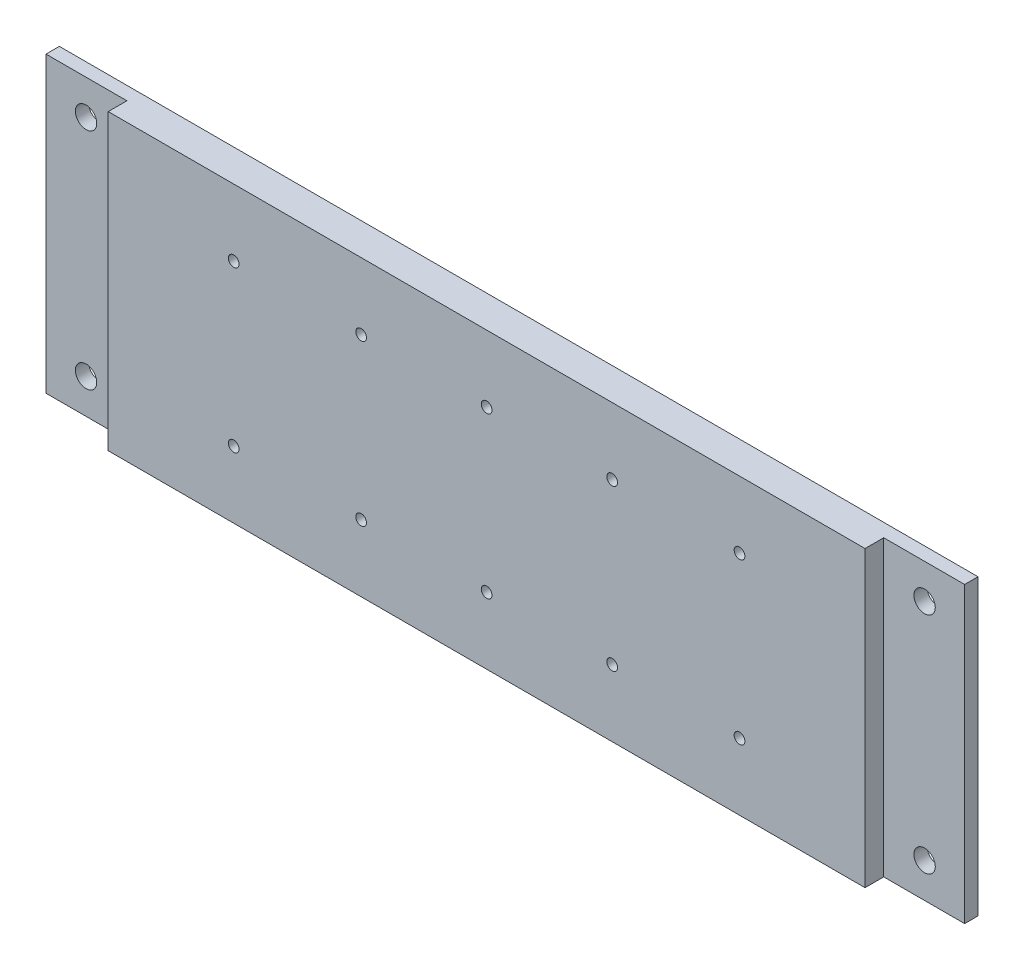
ISO-10303-21;
HEADER;
FILE_DESCRIPTION(('STEP AP214'),'2;1');
FILE_NAME('part.step','',(''),(''),'','','');
FILE_SCHEMA(('AUTOMOTIVE_DESIGN { 1 0 10303 214 1 1 1 1 }'));
ENDSEC;
DATA;
#1=APPLICATION_CONTEXT('core data for automotive mechanical design processes');
#2=APPLICATION_PROTOCOL_DEFINITION('international standard','automotive_design',2000,#1);
#3=PRODUCT_CONTEXT('',#1,'mechanical');
#4=PRODUCT('Part','Part','',(#3));
#5=PRODUCT_RELATED_PRODUCT_CATEGORY('part','',(#4));
#6=PRODUCT_DEFINITION_FORMATION('','',#4);
#7=PRODUCT_DEFINITION_CONTEXT('part definition',#1,'design');
#8=PRODUCT_DEFINITION('design','',#6,#7);
#9=PRODUCT_DEFINITION_SHAPE('','',#8);
#10=(LENGTH_UNIT() NAMED_UNIT(*) SI_UNIT(.MILLI.,.METRE.));
#11=(NAMED_UNIT(*) PLANE_ANGLE_UNIT() SI_UNIT($,.RADIAN.));
#12=(NAMED_UNIT(*) SI_UNIT($,.STERADIAN.) SOLID_ANGLE_UNIT());
#13=UNCERTAINTY_MEASURE_WITH_UNIT(LENGTH_MEASURE(1.E-05),#10,'distance_accuracy_value','');
#14=(GEOMETRIC_REPRESENTATION_CONTEXT(3) GLOBAL_UNCERTAINTY_ASSIGNED_CONTEXT((#13)) GLOBAL_UNIT_ASSIGNED_CONTEXT((#10,
#11,#12)) REPRESENTATION_CONTEXT('',''));
#15=CARTESIAN_POINT('',(0.,0.,0.));
#16=DIRECTION('',(0.,0.,1.));
#17=DIRECTION('',(1.,0.,0.));
#18=AXIS2_PLACEMENT_3D('',#15,#16,#17);
#19=CARTESIAN_POINT('',(-86.,27.5,6.));
#20=DIRECTION('',(1.,0.,0.));
#21=DIRECTION('',(0.,0.,-1.));
#22=AXIS2_PLACEMENT_3D('',#19,#20,#21);
#23=PLANE('',#22);
#24=DIRECTION('',(0.,-1.,0.));
#25=VECTOR('',#24,1.);
#26=CARTESIAN_POINT('',(-86.,27.5,2.5));
#27=LINE('',#26,#25);
#28=CARTESIAN_POINT('',(-86.,27.5,2.5));
#29=VERTEX_POINT('',#28);
#30=CARTESIAN_POINT('',(-86.,-27.5,2.5));
#31=VERTEX_POINT('',#30);
#32=EDGE_CURVE('E148',#29,#31,#27,.T.);
#33=ORIENTED_EDGE('',*,*,#32,.F.);
#34=DIRECTION('',(0.,0.,-1.));
#35=VECTOR('',#34,1.);
#36=CARTESIAN_POINT('',(-86.,27.5,6.));
#37=LINE('',#36,#35);
#38=CARTESIAN_POINT('',(-86.,27.5,0.));
#39=VERTEX_POINT('',#38);
#40=EDGE_CURVE('E42',#29,#39,#37,.T.);
#41=ORIENTED_EDGE('',*,*,#40,.T.);
#42=DIRECTION('',(0.,-1.,0.));
#43=VECTOR('',#42,1.);
#44=CARTESIAN_POINT('',(-86.,27.5,0.));
#45=LINE('',#44,#43);
#46=CARTESIAN_POINT('',(-86.,-27.5,0.));
#47=VERTEX_POINT('',#46);
#48=EDGE_CURVE('E128',#39,#47,#45,.T.);
#49=ORIENTED_EDGE('',*,*,#48,.T.);
#50=DIRECTION('',(0.,0.,-1.));
#51=VECTOR('',#50,1.);
#52=CARTESIAN_POINT('',(-86.,-27.5,6.));
#53=LINE('',#52,#51);
#54=EDGE_CURVE('E142',#31,#47,#53,.T.);
#55=ORIENTED_EDGE('',*,*,#54,.F.);
#56=EDGE_LOOP('',(#33,#41,#49,#55));
#57=FACE_BOUND('',#56,.T.);
#58=ADVANCED_FACE('F34',(#57),#23,.F.);
#59=CARTESIAN_POINT('',(86.,27.5,6.));
#60=DIRECTION('',(-1.,0.,0.));
#61=DIRECTION('',(0.,0.,1.));
#62=AXIS2_PLACEMENT_3D('',#59,#60,#61);
#63=PLANE('',#62);
#64=DIRECTION('',(0.,0.,-1.));
#65=VECTOR('',#64,1.);
#66=CARTESIAN_POINT('',(86.,27.5,6.));
#67=LINE('',#66,#65);
#68=CARTESIAN_POINT('',(86.,27.5,2.5));
#69=VERTEX_POINT('',#68);
#70=CARTESIAN_POINT('',(86.,27.5,0.));
#71=VERTEX_POINT('',#70);
#72=EDGE_CURVE('E11',#69,#71,#67,.T.);
#73=ORIENTED_EDGE('',*,*,#72,.F.);
#74=DIRECTION('',(0.,1.,0.));
#75=VECTOR('',#74,1.);
#76=CARTESIAN_POINT('',(86.,27.5,2.5));
#77=LINE('',#76,#75);
#78=CARTESIAN_POINT('',(86.,-27.5,2.5));
#79=VERTEX_POINT('',#78);
#80=EDGE_CURVE('E99',#79,#69,#77,.T.);
#81=ORIENTED_EDGE('',*,*,#80,.F.);
#82=DIRECTION('',(0.,0.,-1.));
#83=VECTOR('',#82,1.);
#84=CARTESIAN_POINT('',(86.,-27.5,6.));
#85=LINE('',#84,#83);
#86=CARTESIAN_POINT('',(86.,-27.5,0.));
#87=VERTEX_POINT('',#86);
#88=EDGE_CURVE('E121',#79,#87,#85,.T.);
#89=ORIENTED_EDGE('',*,*,#88,.T.);
#90=DIRECTION('',(0.,1.,0.));
#91=VECTOR('',#90,1.);
#92=CARTESIAN_POINT('',(86.,27.5,0.));
#93=LINE('',#92,#91);
#94=EDGE_CURVE('E120',#87,#71,#93,.T.);
#95=ORIENTED_EDGE('',*,*,#94,.T.);
#96=EDGE_LOOP('',(#73,#81,#89,#95));
#97=FACE_BOUND('',#96,.T.);
#98=ADVANCED_FACE('F36',(#97),#63,.F.);
#99=CARTESIAN_POINT('',(-86.,27.5,6.));
#100=DIRECTION('',(0.,-1.,0.));
#101=DIRECTION('',(0.,0.,-1.));
#102=AXIS2_PLACEMENT_3D('',#99,#100,#101);
#103=PLANE('',#102);
#104=DIRECTION('',(-1.,0.,0.));
#105=VECTOR('',#104,1.);
#106=CARTESIAN_POINT('',(-86.,27.5,6.));
#107=LINE('',#106,#105);
#108=CARTESIAN_POINT('',(70.85,27.5,6.));
#109=VERTEX_POINT('',#108);
#110=CARTESIAN_POINT('',(-70.85,27.5,6.));
#111=VERTEX_POINT('',#110);
#112=EDGE_CURVE('E140',#109,#111,#107,.T.);
#113=ORIENTED_EDGE('',*,*,#112,.F.);
#114=DIRECTION('',(0.,0.,1.));
#115=VECTOR('',#114,1.);
#116=CARTESIAN_POINT('',(70.85,27.5,2.5));
#117=LINE('',#116,#115);
#118=CARTESIAN_POINT('',(70.85,27.5,2.5));
#119=VERTEX_POINT('',#118);
#120=EDGE_CURVE('E49',#119,#109,#117,.T.);
#121=ORIENTED_EDGE('',*,*,#120,.F.);
#122=DIRECTION('',(-1.,0.,0.));
#123=VECTOR('',#122,1.);
#124=CARTESIAN_POINT('',(86.,27.5,2.5));
#125=LINE('',#124,#123);
#126=EDGE_CURVE('E103',#69,#119,#125,.T.);
#127=ORIENTED_EDGE('',*,*,#126,.F.);
#128=ORIENTED_EDGE('',*,*,#72,.T.);
#129=DIRECTION('',(-1.,0.,0.));
#130=VECTOR('',#129,1.);
#131=CARTESIAN_POINT('',(-86.,27.5,0.));
#132=LINE('',#131,#130);
#133=EDGE_CURVE('E125',#71,#39,#132,.T.);
#134=ORIENTED_EDGE('',*,*,#133,.T.);
#135=ORIENTED_EDGE('',*,*,#40,.F.);
#136=DIRECTION('',(-1.,0.,0.));
#137=VECTOR('',#136,1.);
#138=CARTESIAN_POINT('',(-86.,27.5,2.5));
#139=LINE('',#138,#137);
#140=CARTESIAN_POINT('',(-70.85,27.5,2.5));
#141=VERTEX_POINT('',#140);
#142=EDGE_CURVE('E161',#141,#29,#139,.T.);
#143=ORIENTED_EDGE('',*,*,#142,.F.);
#144=DIRECTION('',(0.,0.,1.));
#145=VECTOR('',#144,1.);
#146=CARTESIAN_POINT('',(-70.85,27.5,2.5));
#147=LINE('',#146,#145);
#148=EDGE_CURVE('E126',#141,#111,#147,.T.);
#149=ORIENTED_EDGE('',*,*,#148,.T.);
#150=EDGE_LOOP('',(#113,#121,#127,#128,#134,#135,#143,#149));
#151=FACE_BOUND('',#150,.T.);
#152=ADVANCED_FACE('F113',(#151),#103,.F.);
#153=CARTESIAN_POINT('',(-86.,-27.5,6.));
#154=DIRECTION('',(0.,1.,0.));
#155=DIRECTION('',(0.,0.,1.));
#156=AXIS2_PLACEMENT_3D('',#153,#154,#155);
#157=PLANE('',#156);
#158=DIRECTION('',(1.,0.,0.));
#159=VECTOR('',#158,1.);
#160=CARTESIAN_POINT('',(86.,-27.5,2.5));
#161=LINE('',#160,#159);
#162=CARTESIAN_POINT('',(70.85,-27.5,2.5));
#163=VERTEX_POINT('',#162);
#164=EDGE_CURVE('E105',#163,#79,#161,.T.);
#165=ORIENTED_EDGE('',*,*,#164,.F.);
#166=DIRECTION('',(0.,0.,1.));
#167=VECTOR('',#166,1.);
#168=CARTESIAN_POINT('',(70.85,-27.5,2.5));
#169=LINE('',#168,#167);
#170=CARTESIAN_POINT('',(70.85,-27.5,6.));
#171=VERTEX_POINT('',#170);
#172=EDGE_CURVE('E168',#163,#171,#169,.T.);
#173=ORIENTED_EDGE('',*,*,#172,.T.);
#174=DIRECTION('',(1.,0.,0.));
#175=VECTOR('',#174,1.);
#176=CARTESIAN_POINT('',(-86.,-27.5,6.));
#177=LINE('',#176,#175);
#178=CARTESIAN_POINT('',(-70.85,-27.5,6.));
#179=VERTEX_POINT('',#178);
#180=EDGE_CURVE('E133',#179,#171,#177,.T.);
#181=ORIENTED_EDGE('',*,*,#180,.F.);
#182=DIRECTION('',(0.,0.,1.));
#183=VECTOR('',#182,1.);
#184=CARTESIAN_POINT('',(-70.85,-27.5,2.5));
#185=LINE('',#184,#183);
#186=CARTESIAN_POINT('',(-70.85,-27.5,2.5));
#187=VERTEX_POINT('',#186);
#188=EDGE_CURVE('E57',#187,#179,#185,.T.);
#189=ORIENTED_EDGE('',*,*,#188,.F.);
#190=DIRECTION('',(1.,0.,0.));
#191=VECTOR('',#190,1.);
#192=CARTESIAN_POINT('',(-86.,-27.5,2.5));
#193=LINE('',#192,#191);
#194=EDGE_CURVE('E155',#31,#187,#193,.T.);
#195=ORIENTED_EDGE('',*,*,#194,.F.);
#196=ORIENTED_EDGE('',*,*,#54,.T.);
#197=DIRECTION('',(1.,0.,0.));
#198=VECTOR('',#197,1.);
#199=CARTESIAN_POINT('',(-86.,-27.5,0.));
#200=LINE('',#199,#198);
#201=EDGE_CURVE('E138',#47,#87,#200,.T.);
#202=ORIENTED_EDGE('',*,*,#201,.T.);
#203=ORIENTED_EDGE('',*,*,#88,.F.);
#204=EDGE_LOOP('',(#165,#173,#181,#189,#195,#196,#202,#203));
#205=FACE_BOUND('',#204,.T.);
#206=ADVANCED_FACE('F152',(#205),#157,.F.);
#207=CARTESIAN_POINT('',(0.,0.,6.));
#208=DIRECTION('',(0.,0.,1.));
#209=DIRECTION('',(1.,0.,0.));
#210=AXIS2_PLACEMENT_3D('',#207,#208,#209);
#211=PLANE('',#210);
#212=CARTESIAN_POINT('',(0.,-15.,6.));
#213=DIRECTION('',(0.,0.,1.));
#214=DIRECTION('',(-1.,0.,0.));
#215=AXIS2_PLACEMENT_3D('',#212,#213,#214);
#216=CIRCLE('',#215,1.005);
#217=CARTESIAN_POINT('',(-1.005,-15.,6.));
#218=VERTEX_POINT('',#217);
#219=EDGE_CURVE('E258',#218,#218,#216,.T.);
#220=ORIENTED_EDGE('',*,*,#219,.F.);
#221=EDGE_LOOP('',(#220));
#222=FACE_BOUND('',#221,.T.);
#223=CARTESIAN_POINT('',(0.,15.,6.));
#224=DIRECTION('',(0.,0.,1.));
#225=DIRECTION('',(1.,0.,0.));
#226=AXIS2_PLACEMENT_3D('',#223,#224,#225);
#227=CIRCLE('',#226,1.005);
#228=CARTESIAN_POINT('',(1.005,15.,6.));
#229=VERTEX_POINT('',#228);
#230=EDGE_CURVE('E252',#229,#229,#227,.T.);
#231=ORIENTED_EDGE('',*,*,#230,.F.);
#232=EDGE_LOOP('',(#231));
#233=FACE_BOUND('',#232,.T.);
#234=CARTESIAN_POINT('',(-47.35,-15.,6.));
#235=DIRECTION('',(0.,0.,1.));
#236=DIRECTION('',(-1.,0.,0.));
#237=AXIS2_PLACEMENT_3D('',#234,#235,#236);
#238=CIRCLE('',#237,1.005);
#239=CARTESIAN_POINT('',(-48.355,-15.,6.));
#240=VERTEX_POINT('',#239);
#241=EDGE_CURVE('E246',#240,#240,#238,.T.);
#242=ORIENTED_EDGE('',*,*,#241,.F.);
#243=EDGE_LOOP('',(#242));
#244=FACE_BOUND('',#243,.T.);
#245=CARTESIAN_POINT('',(-23.5,-15.,6.));
#246=DIRECTION('',(0.,0.,1.));
#247=DIRECTION('',(-1.,0.,0.));
#248=AXIS2_PLACEMENT_3D('',#245,#246,#247);
#249=CIRCLE('',#248,1.005);
#250=CARTESIAN_POINT('',(-24.505,-15.,6.));
#251=VERTEX_POINT('',#250);
#252=EDGE_CURVE('E240',#251,#251,#249,.T.);
#253=ORIENTED_EDGE('',*,*,#252,.F.);
#254=EDGE_LOOP('',(#253));
#255=FACE_BOUND('',#254,.T.);
#256=CARTESIAN_POINT('',(23.5,-15.,6.));
#257=DIRECTION('',(0.,0.,1.));
#258=DIRECTION('',(1.,0.,0.));
#259=AXIS2_PLACEMENT_3D('',#256,#257,#258);
#260=CIRCLE('',#259,1.005);
#261=CARTESIAN_POINT('',(24.505,-15.,6.));
#262=VERTEX_POINT('',#261);
#263=EDGE_CURVE('E234',#262,#262,#260,.T.);
#264=ORIENTED_EDGE('',*,*,#263,.F.);
#265=EDGE_LOOP('',(#264));
#266=FACE_BOUND('',#265,.T.);
#267=CARTESIAN_POINT('',(47.35,-15.,6.));
#268=DIRECTION('',(0.,0.,1.));
#269=DIRECTION('',(1.,0.,0.));
#270=AXIS2_PLACEMENT_3D('',#267,#268,#269);
#271=CIRCLE('',#270,1.005);
#272=CARTESIAN_POINT('',(48.355,-15.,6.));
#273=VERTEX_POINT('',#272);
#274=EDGE_CURVE('E228',#273,#273,#271,.T.);
#275=ORIENTED_EDGE('',*,*,#274,.F.);
#276=EDGE_LOOP('',(#275));
#277=FACE_BOUND('',#276,.T.);
#278=CARTESIAN_POINT('',(47.35,15.,6.));
#279=DIRECTION('',(0.,0.,1.));
#280=DIRECTION('',(-1.,0.,0.));
#281=AXIS2_PLACEMENT_3D('',#278,#279,#280);
#282=CIRCLE('',#281,1.005);
#283=CARTESIAN_POINT('',(46.345,15.,6.));
#284=VERTEX_POINT('',#283);
#285=EDGE_CURVE('E222',#284,#284,#282,.T.);
#286=ORIENTED_EDGE('',*,*,#285,.F.);
#287=EDGE_LOOP('',(#286));
#288=FACE_BOUND('',#287,.T.);
#289=CARTESIAN_POINT('',(23.5,15.,6.));
#290=DIRECTION('',(0.,0.,1.));
#291=DIRECTION('',(-1.,0.,0.));
#292=AXIS2_PLACEMENT_3D('',#289,#290,#291);
#293=CIRCLE('',#292,1.005);
#294=CARTESIAN_POINT('',(22.495,15.,6.));
#295=VERTEX_POINT('',#294);
#296=EDGE_CURVE('E216',#295,#295,#293,.T.);
#297=ORIENTED_EDGE('',*,*,#296,.F.);
#298=EDGE_LOOP('',(#297));
#299=FACE_BOUND('',#298,.T.);
#300=CARTESIAN_POINT('',(-23.5,15.,6.));
#301=DIRECTION('',(0.,0.,1.));
#302=DIRECTION('',(1.,0.,0.));
#303=AXIS2_PLACEMENT_3D('',#300,#301,#302);
#304=CIRCLE('',#303,1.005);
#305=CARTESIAN_POINT('',(-22.495,15.,6.));
#306=VERTEX_POINT('',#305);
#307=EDGE_CURVE('E210',#306,#306,#304,.T.);
#308=ORIENTED_EDGE('',*,*,#307,.F.);
#309=EDGE_LOOP('',(#308));
#310=FACE_BOUND('',#309,.T.);
#311=CARTESIAN_POINT('',(-47.35,15.,6.));
#312=DIRECTION('',(0.,0.,1.));
#313=DIRECTION('',(1.,0.,0.));
#314=AXIS2_PLACEMENT_3D('',#311,#312,#313);
#315=CIRCLE('',#314,1.005);
#316=CARTESIAN_POINT('',(-46.345,15.,6.));
#317=VERTEX_POINT('',#316);
#318=EDGE_CURVE('E204',#317,#317,#315,.T.);
#319=ORIENTED_EDGE('',*,*,#318,.F.);
#320=EDGE_LOOP('',(#319));
#321=FACE_BOUND('',#320,.T.);
#322=DIRECTION('',(0.,-1.,0.));
#323=VECTOR('',#322,1.);
#324=CARTESIAN_POINT('',(70.85,27.5,6.));
#325=LINE('',#324,#323);
#326=EDGE_CURVE('E109',#109,#171,#325,.T.);
#327=ORIENTED_EDGE('',*,*,#326,.F.);
#328=ORIENTED_EDGE('',*,*,#112,.T.);
#329=DIRECTION('',(0.,1.,0.));
#330=VECTOR('',#329,1.);
#331=CARTESIAN_POINT('',(-70.85,27.5,6.));
#332=LINE('',#331,#330);
#333=EDGE_CURVE('E163',#179,#111,#332,.T.);
#334=ORIENTED_EDGE('',*,*,#333,.F.);
#335=ORIENTED_EDGE('',*,*,#180,.T.);
#336=EDGE_LOOP('',(#327,#328,#334,#335));
#337=FACE_BOUND('',#336,.T.);
#338=ADVANCED_FACE('F172',(#222,#233,#244,#255,#266,#277,#288,#299,#310,#321,#337),#211,.T.);
#339=CARTESIAN_POINT('',(0.,0.,0.));
#340=DIRECTION('',(0.,0.,1.));
#341=DIRECTION('',(1.,0.,0.));
#342=AXIS2_PLACEMENT_3D('',#339,#340,#341);
#343=PLANE('',#342);
#344=CARTESIAN_POINT('',(0.,-15.,0.));
#345=DIRECTION('',(0.,0.,1.));
#346=DIRECTION('',(-1.,0.,0.));
#347=AXIS2_PLACEMENT_3D('',#344,#345,#346);
#348=CIRCLE('',#347,1.005);
#349=CARTESIAN_POINT('',(-1.005,-15.,0.));
#350=VERTEX_POINT('',#349);
#351=EDGE_CURVE('E255',#350,#350,#348,.T.);
#352=ORIENTED_EDGE('',*,*,#351,.T.);
#353=EDGE_LOOP('',(#352));
#354=FACE_BOUND('',#353,.T.);
#355=CARTESIAN_POINT('',(0.,15.,0.));
#356=DIRECTION('',(0.,0.,1.));
#357=DIRECTION('',(1.,0.,0.));
#358=AXIS2_PLACEMENT_3D('',#355,#356,#357);
#359=CIRCLE('',#358,1.005);
#360=CARTESIAN_POINT('',(1.005,15.,0.));
#361=VERTEX_POINT('',#360);
#362=EDGE_CURVE('E249',#361,#361,#359,.T.);
#363=ORIENTED_EDGE('',*,*,#362,.T.);
#364=EDGE_LOOP('',(#363));
#365=FACE_BOUND('',#364,.T.);
#366=CARTESIAN_POINT('',(-47.35,-15.,0.));
#367=DIRECTION('',(0.,0.,1.));
#368=DIRECTION('',(-1.,0.,0.));
#369=AXIS2_PLACEMENT_3D('',#366,#367,#368);
#370=CIRCLE('',#369,1.005);
#371=CARTESIAN_POINT('',(-48.355,-15.,0.));
#372=VERTEX_POINT('',#371);
#373=EDGE_CURVE('E243',#372,#372,#370,.T.);
#374=ORIENTED_EDGE('',*,*,#373,.T.);
#375=EDGE_LOOP('',(#374));
#376=FACE_BOUND('',#375,.T.);
#377=CARTESIAN_POINT('',(-23.5,-15.,0.));
#378=DIRECTION('',(0.,0.,1.));
#379=DIRECTION('',(-1.,0.,0.));
#380=AXIS2_PLACEMENT_3D('',#377,#378,#379);
#381=CIRCLE('',#380,1.005);
#382=CARTESIAN_POINT('',(-24.505,-15.,0.));
#383=VERTEX_POINT('',#382);
#384=EDGE_CURVE('E237',#383,#383,#381,.T.);
#385=ORIENTED_EDGE('',*,*,#384,.T.);
#386=EDGE_LOOP('',(#385));
#387=FACE_BOUND('',#386,.T.);
#388=CARTESIAN_POINT('',(23.5,-15.,0.));
#389=DIRECTION('',(0.,0.,1.));
#390=DIRECTION('',(1.,0.,0.));
#391=AXIS2_PLACEMENT_3D('',#388,#389,#390);
#392=CIRCLE('',#391,1.005);
#393=CARTESIAN_POINT('',(24.505,-15.,0.));
#394=VERTEX_POINT('',#393);
#395=EDGE_CURVE('E231',#394,#394,#392,.T.);
#396=ORIENTED_EDGE('',*,*,#395,.T.);
#397=EDGE_LOOP('',(#396));
#398=FACE_BOUND('',#397,.T.);
#399=CARTESIAN_POINT('',(47.35,-15.,0.));
#400=DIRECTION('',(0.,0.,1.));
#401=DIRECTION('',(1.,0.,0.));
#402=AXIS2_PLACEMENT_3D('',#399,#400,#401);
#403=CIRCLE('',#402,1.005);
#404=CARTESIAN_POINT('',(48.355,-15.,0.));
#405=VERTEX_POINT('',#404);
#406=EDGE_CURVE('E225',#405,#405,#403,.T.);
#407=ORIENTED_EDGE('',*,*,#406,.T.);
#408=EDGE_LOOP('',(#407));
#409=FACE_BOUND('',#408,.T.);
#410=CARTESIAN_POINT('',(47.35,15.,0.));
#411=DIRECTION('',(0.,0.,1.));
#412=DIRECTION('',(-1.,0.,0.));
#413=AXIS2_PLACEMENT_3D('',#410,#411,#412);
#414=CIRCLE('',#413,1.005);
#415=CARTESIAN_POINT('',(46.345,15.,0.));
#416=VERTEX_POINT('',#415);
#417=EDGE_CURVE('E219',#416,#416,#414,.T.);
#418=ORIENTED_EDGE('',*,*,#417,.T.);
#419=EDGE_LOOP('',(#418));
#420=FACE_BOUND('',#419,.T.);
#421=CARTESIAN_POINT('',(23.5,15.,0.));
#422=DIRECTION('',(0.,0.,1.));
#423=DIRECTION('',(-1.,0.,0.));
#424=AXIS2_PLACEMENT_3D('',#421,#422,#423);
#425=CIRCLE('',#424,1.005);
#426=CARTESIAN_POINT('',(22.495,15.,0.));
#427=VERTEX_POINT('',#426);
#428=EDGE_CURVE('E213',#427,#427,#425,.T.);
#429=ORIENTED_EDGE('',*,*,#428,.T.);
#430=EDGE_LOOP('',(#429));
#431=FACE_BOUND('',#430,.T.);
#432=CARTESIAN_POINT('',(-23.5,15.,0.));
#433=DIRECTION('',(0.,0.,1.));
#434=DIRECTION('',(1.,0.,0.));
#435=AXIS2_PLACEMENT_3D('',#432,#433,#434);
#436=CIRCLE('',#435,1.005);
#437=CARTESIAN_POINT('',(-22.495,15.,0.));
#438=VERTEX_POINT('',#437);
#439=EDGE_CURVE('E207',#438,#438,#436,.T.);
#440=ORIENTED_EDGE('',*,*,#439,.T.);
#441=EDGE_LOOP('',(#440));
#442=FACE_BOUND('',#441,.T.);
#443=CARTESIAN_POINT('',(-47.35,15.,0.));
#444=DIRECTION('',(0.,0.,1.));
#445=DIRECTION('',(1.,0.,0.));
#446=AXIS2_PLACEMENT_3D('',#443,#444,#445);
#447=CIRCLE('',#446,1.005);
#448=CARTESIAN_POINT('',(-46.345,15.,0.));
#449=VERTEX_POINT('',#448);
#450=EDGE_CURVE('E201',#449,#449,#447,.T.);
#451=ORIENTED_EDGE('',*,*,#450,.T.);
#452=EDGE_LOOP('',(#451));
#453=FACE_BOUND('',#452,.T.);
#454=CARTESIAN_POINT('',(78.5,21.,0.));
#455=DIRECTION('',(0.,0.,1.));
#456=DIRECTION('',(1.,0.,0.));
#457=AXIS2_PLACEMENT_3D('',#454,#455,#456);
#458=CIRCLE('',#457,2.);
#459=CARTESIAN_POINT('',(80.5,21.,0.));
#460=VERTEX_POINT('',#459);
#461=EDGE_CURVE('E195',#460,#460,#458,.T.);
#462=ORIENTED_EDGE('',*,*,#461,.T.);
#463=EDGE_LOOP('',(#462));
#464=FACE_BOUND('',#463,.T.);
#465=CARTESIAN_POINT('',(78.5,-21.,0.));
#466=DIRECTION('',(0.,0.,1.));
#467=DIRECTION('',(-1.,0.,0.));
#468=AXIS2_PLACEMENT_3D('',#465,#466,#467);
#469=CIRCLE('',#468,2.);
#470=CARTESIAN_POINT('',(76.5,-21.,0.));
#471=VERTEX_POINT('',#470);
#472=EDGE_CURVE('E189',#471,#471,#469,.T.);
#473=ORIENTED_EDGE('',*,*,#472,.T.);
#474=EDGE_LOOP('',(#473));
#475=FACE_BOUND('',#474,.T.);
#476=CARTESIAN_POINT('',(-78.5,-21.,0.));
#477=DIRECTION('',(0.,0.,1.));
#478=DIRECTION('',(1.,0.,0.));
#479=AXIS2_PLACEMENT_3D('',#476,#477,#478);
#480=CIRCLE('',#479,2.);
#481=CARTESIAN_POINT('',(-76.5,-21.,0.));
#482=VERTEX_POINT('',#481);
#483=EDGE_CURVE('E183',#482,#482,#480,.T.);
#484=ORIENTED_EDGE('',*,*,#483,.T.);
#485=EDGE_LOOP('',(#484));
#486=FACE_BOUND('',#485,.T.);
#487=CARTESIAN_POINT('',(-78.5,21.,0.));
#488=DIRECTION('',(0.,0.,1.));
#489=DIRECTION('',(-1.,0.,0.));
#490=AXIS2_PLACEMENT_3D('',#487,#488,#489);
#491=CIRCLE('',#490,2.);
#492=CARTESIAN_POINT('',(-80.5,21.,0.));
#493=VERTEX_POINT('',#492);
#494=EDGE_CURVE('E177',#493,#493,#491,.T.);
#495=ORIENTED_EDGE('',*,*,#494,.T.);
#496=EDGE_LOOP('',(#495));
#497=FACE_BOUND('',#496,.T.);
#498=ORIENTED_EDGE('',*,*,#94,.F.);
#499=ORIENTED_EDGE('',*,*,#201,.F.);
#500=ORIENTED_EDGE('',*,*,#48,.F.);
#501=ORIENTED_EDGE('',*,*,#133,.F.);
#502=EDGE_LOOP('',(#498,#499,#500,#501));
#503=FACE_BOUND('',#502,.T.);
#504=ADVANCED_FACE('F150',(#354,#365,#376,#387,#398,#409,#420,#431,#442,#453,#464,#475,#486,
#497,#503),#343,.F.);
#505=CARTESIAN_POINT('',(-70.85,27.5,2.5));
#506=DIRECTION('',(1.,0.,0.));
#507=DIRECTION('',(0.,0.,-1.));
#508=AXIS2_PLACEMENT_3D('',#505,#506,#507);
#509=PLANE('',#508);
#510=ORIENTED_EDGE('',*,*,#333,.T.);
#511=ORIENTED_EDGE('',*,*,#148,.F.);
#512=DIRECTION('',(0.,1.,0.));
#513=VECTOR('',#512,1.);
#514=CARTESIAN_POINT('',(-70.85,27.5,2.5));
#515=LINE('',#514,#513);
#516=EDGE_CURVE('E159',#187,#141,#515,.T.);
#517=ORIENTED_EDGE('',*,*,#516,.F.);
#518=ORIENTED_EDGE('',*,*,#188,.T.);
#519=EDGE_LOOP('',(#510,#511,#517,#518));
#520=FACE_BOUND('',#519,.T.);
#521=ADVANCED_FACE('F336',(#520),#509,.F.);
#522=CARTESIAN_POINT('',(0.,0.,2.5));
#523=DIRECTION('',(0.,0.,1.));
#524=DIRECTION('',(1.,0.,0.));
#525=AXIS2_PLACEMENT_3D('',#522,#523,#524);
#526=PLANE('',#525);
#527=CARTESIAN_POINT('',(-78.5,-21.,2.5));
#528=DIRECTION('',(0.,0.,1.));
#529=DIRECTION('',(1.,0.,0.));
#530=AXIS2_PLACEMENT_3D('',#527,#528,#529);
#531=CIRCLE('',#530,2.);
#532=CARTESIAN_POINT('',(-76.5,-21.,2.5));
#533=VERTEX_POINT('',#532);
#534=EDGE_CURVE('E186',#533,#533,#531,.T.);
#535=ORIENTED_EDGE('',*,*,#534,.F.);
#536=EDGE_LOOP('',(#535));
#537=FACE_BOUND('',#536,.T.);
#538=CARTESIAN_POINT('',(-78.5,21.,2.5));
#539=DIRECTION('',(0.,0.,1.));
#540=DIRECTION('',(-1.,0.,0.));
#541=AXIS2_PLACEMENT_3D('',#538,#539,#540);
#542=CIRCLE('',#541,2.);
#543=CARTESIAN_POINT('',(-80.5,21.,2.5));
#544=VERTEX_POINT('',#543);
#545=EDGE_CURVE('E180',#544,#544,#542,.T.);
#546=ORIENTED_EDGE('',*,*,#545,.F.);
#547=EDGE_LOOP('',(#546));
#548=FACE_BOUND('',#547,.T.);
#549=ORIENTED_EDGE('',*,*,#32,.T.);
#550=ORIENTED_EDGE('',*,*,#194,.T.);
#551=ORIENTED_EDGE('',*,*,#516,.T.);
#552=ORIENTED_EDGE('',*,*,#142,.T.);
#553=EDGE_LOOP('',(#549,#550,#551,#552));
#554=FACE_BOUND('',#553,.T.);
#555=ADVANCED_FACE('F341',(#537,#548,#554),#526,.T.);
#556=CARTESIAN_POINT('',(70.85,27.5,2.5));
#557=DIRECTION('',(-1.,0.,0.));
#558=DIRECTION('',(0.,0.,1.));
#559=AXIS2_PLACEMENT_3D('',#556,#557,#558);
#560=PLANE('',#559);
#561=ORIENTED_EDGE('',*,*,#326,.T.);
#562=ORIENTED_EDGE('',*,*,#172,.F.);
#563=DIRECTION('',(0.,-1.,0.));
#564=VECTOR('',#563,1.);
#565=CARTESIAN_POINT('',(70.85,27.5,2.5));
#566=LINE('',#565,#564);
#567=EDGE_CURVE('E116',#119,#163,#566,.T.);
#568=ORIENTED_EDGE('',*,*,#567,.F.);
#569=ORIENTED_EDGE('',*,*,#120,.T.);
#570=EDGE_LOOP('',(#561,#562,#568,#569));
#571=FACE_BOUND('',#570,.T.);
#572=ADVANCED_FACE('F349',(#571),#560,.F.);
#573=CARTESIAN_POINT('',(0.,0.,2.5));
#574=DIRECTION('',(0.,0.,-1.));
#575=DIRECTION('',(-1.,0.,0.));
#576=AXIS2_PLACEMENT_3D('',#573,#574,#575);
#577=PLANE('',#576);
#578=CARTESIAN_POINT('',(78.5,21.,2.5));
#579=DIRECTION('',(0.,0.,1.));
#580=DIRECTION('',(1.,0.,0.));
#581=AXIS2_PLACEMENT_3D('',#578,#579,#580);
#582=CIRCLE('',#581,2.);
#583=CARTESIAN_POINT('',(80.5,21.,2.5));
#584=VERTEX_POINT('',#583);
#585=EDGE_CURVE('E198',#584,#584,#582,.T.);
#586=ORIENTED_EDGE('',*,*,#585,.F.);
#587=EDGE_LOOP('',(#586));
#588=FACE_BOUND('',#587,.T.);
#589=CARTESIAN_POINT('',(78.5,-21.,2.5));
#590=DIRECTION('',(0.,0.,1.));
#591=DIRECTION('',(-1.,0.,0.));
#592=AXIS2_PLACEMENT_3D('',#589,#590,#591);
#593=CIRCLE('',#592,2.);
#594=CARTESIAN_POINT('',(76.5,-21.,2.5));
#595=VERTEX_POINT('',#594);
#596=EDGE_CURVE('E192',#595,#595,#593,.T.);
#597=ORIENTED_EDGE('',*,*,#596,.F.);
#598=EDGE_LOOP('',(#597));
#599=FACE_BOUND('',#598,.T.);
#600=ORIENTED_EDGE('',*,*,#80,.T.);
#601=ORIENTED_EDGE('',*,*,#126,.T.);
#602=ORIENTED_EDGE('',*,*,#567,.T.);
#603=ORIENTED_EDGE('',*,*,#164,.T.);
#604=EDGE_LOOP('',(#600,#601,#602,#603));
#605=FACE_BOUND('',#604,.T.);
#606=ADVANCED_FACE('F101',(#588,#599,#605),#577,.F.);
#607=CARTESIAN_POINT('',(-78.5,21.,0.));
#608=DIRECTION('',(0.,0.,1.));
#609=DIRECTION('',(1.,0.,0.));
#610=AXIS2_PLACEMENT_3D('',#607,#608,#609);
#611=CYLINDRICAL_SURFACE('',#610,2.);
#612=ORIENTED_EDGE('',*,*,#494,.F.);
#613=EDGE_LOOP('',(#612));
#614=FACE_BOUND('',#613,.T.);
#615=ORIENTED_EDGE('',*,*,#545,.T.);
#616=EDGE_LOOP('',(#615));
#617=FACE_BOUND('',#616,.T.);
#618=ADVANCED_FACE('F362',(#614,#617),#611,.F.);
#619=CARTESIAN_POINT('',(-78.5,-21.,0.));
#620=DIRECTION('',(0.,0.,1.));
#621=DIRECTION('',(1.,0.,0.));
#622=AXIS2_PLACEMENT_3D('',#619,#620,#621);
#623=CYLINDRICAL_SURFACE('',#622,2.);
#624=ORIENTED_EDGE('',*,*,#483,.F.);
#625=EDGE_LOOP('',(#624));
#626=FACE_BOUND('',#625,.T.);
#627=ORIENTED_EDGE('',*,*,#534,.T.);
#628=EDGE_LOOP('',(#627));
#629=FACE_BOUND('',#628,.T.);
#630=ADVANCED_FACE('F370',(#626,#629),#623,.F.);
#631=CARTESIAN_POINT('',(78.5,-21.,0.));
#632=DIRECTION('',(0.,0.,1.));
#633=DIRECTION('',(1.,0.,0.));
#634=AXIS2_PLACEMENT_3D('',#631,#632,#633);
#635=CYLINDRICAL_SURFACE('',#634,2.);
#636=ORIENTED_EDGE('',*,*,#472,.F.);
#637=EDGE_LOOP('',(#636));
#638=FACE_BOUND('',#637,.T.);
#639=ORIENTED_EDGE('',*,*,#596,.T.);
#640=EDGE_LOOP('',(#639));
#641=FACE_BOUND('',#640,.T.);
#642=ADVANCED_FACE('F307',(#638,#641),#635,.F.);
#643=CARTESIAN_POINT('',(78.5,21.,0.));
#644=DIRECTION('',(0.,0.,1.));
#645=DIRECTION('',(1.,0.,0.));
#646=AXIS2_PLACEMENT_3D('',#643,#644,#645);
#647=CYLINDRICAL_SURFACE('',#646,2.);
#648=ORIENTED_EDGE('',*,*,#461,.F.);
#649=EDGE_LOOP('',(#648));
#650=FACE_BOUND('',#649,.T.);
#651=ORIENTED_EDGE('',*,*,#585,.T.);
#652=EDGE_LOOP('',(#651));
#653=FACE_BOUND('',#652,.T.);
#654=ADVANCED_FACE('F297',(#650,#653),#647,.F.);
#655=CARTESIAN_POINT('',(-47.35,15.,0.));
#656=DIRECTION('',(0.,0.,1.));
#657=DIRECTION('',(1.,0.,0.));
#658=AXIS2_PLACEMENT_3D('',#655,#656,#657);
#659=CYLINDRICAL_SURFACE('',#658,1.005);
#660=ORIENTED_EDGE('',*,*,#450,.F.);
#661=EDGE_LOOP('',(#660));
#662=FACE_BOUND('',#661,.T.);
#663=ORIENTED_EDGE('',*,*,#318,.T.);
#664=EDGE_LOOP('',(#663));
#665=FACE_BOUND('',#664,.T.);
#666=ADVANCED_FACE('F294',(#662,#665),#659,.F.);
#667=CARTESIAN_POINT('',(-23.5,15.,0.));
#668=DIRECTION('',(0.,0.,1.));
#669=DIRECTION('',(1.,0.,0.));
#670=AXIS2_PLACEMENT_3D('',#667,#668,#669);
#671=CYLINDRICAL_SURFACE('',#670,1.005);
#672=ORIENTED_EDGE('',*,*,#439,.F.);
#673=EDGE_LOOP('',(#672));
#674=FACE_BOUND('',#673,.T.);
#675=ORIENTED_EDGE('',*,*,#307,.T.);
#676=EDGE_LOOP('',(#675));
#677=FACE_BOUND('',#676,.T.);
#678=ADVANCED_FACE('F296',(#674,#677),#671,.F.);
#679=CARTESIAN_POINT('',(23.5,15.,0.));
#680=DIRECTION('',(0.,0.,1.));
#681=DIRECTION('',(1.,0.,0.));
#682=AXIS2_PLACEMENT_3D('',#679,#680,#681);
#683=CYLINDRICAL_SURFACE('',#682,1.005);
#684=ORIENTED_EDGE('',*,*,#428,.F.);
#685=EDGE_LOOP('',(#684));
#686=FACE_BOUND('',#685,.T.);
#687=ORIENTED_EDGE('',*,*,#296,.T.);
#688=EDGE_LOOP('',(#687));
#689=FACE_BOUND('',#688,.T.);
#690=ADVANCED_FACE('F304',(#686,#689),#683,.F.);
#691=CARTESIAN_POINT('',(47.35,15.,0.));
#692=DIRECTION('',(0.,0.,1.));
#693=DIRECTION('',(1.,0.,0.));
#694=AXIS2_PLACEMENT_3D('',#691,#692,#693);
#695=CYLINDRICAL_SURFACE('',#694,1.005);
#696=ORIENTED_EDGE('',*,*,#417,.F.);
#697=EDGE_LOOP('',(#696));
#698=FACE_BOUND('',#697,.T.);
#699=ORIENTED_EDGE('',*,*,#285,.T.);
#700=EDGE_LOOP('',(#699));
#701=FACE_BOUND('',#700,.T.);
#702=ADVANCED_FACE('F410',(#698,#701),#695,.F.);
#703=CARTESIAN_POINT('',(47.35,-15.,0.));
#704=DIRECTION('',(0.,0.,1.));
#705=DIRECTION('',(1.,0.,0.));
#706=AXIS2_PLACEMENT_3D('',#703,#704,#705);
#707=CYLINDRICAL_SURFACE('',#706,1.005);
#708=ORIENTED_EDGE('',*,*,#406,.F.);
#709=EDGE_LOOP('',(#708));
#710=FACE_BOUND('',#709,.T.);
#711=ORIENTED_EDGE('',*,*,#274,.T.);
#712=EDGE_LOOP('',(#711));
#713=FACE_BOUND('',#712,.T.);
#714=ADVANCED_FACE('F419',(#710,#713),#707,.F.);
#715=CARTESIAN_POINT('',(23.5,-15.,0.));
#716=DIRECTION('',(0.,0.,1.));
#717=DIRECTION('',(1.,0.,0.));
#718=AXIS2_PLACEMENT_3D('',#715,#716,#717);
#719=CYLINDRICAL_SURFACE('',#718,1.005);
#720=ORIENTED_EDGE('',*,*,#395,.F.);
#721=EDGE_LOOP('',(#720));
#722=FACE_BOUND('',#721,.T.);
#723=ORIENTED_EDGE('',*,*,#263,.T.);
#724=EDGE_LOOP('',(#723));
#725=FACE_BOUND('',#724,.T.);
#726=ADVANCED_FACE('F428',(#722,#725),#719,.F.);
#727=CARTESIAN_POINT('',(-23.5,-15.,0.));
#728=DIRECTION('',(0.,0.,1.));
#729=DIRECTION('',(1.,0.,0.));
#730=AXIS2_PLACEMENT_3D('',#727,#728,#729);
#731=CYLINDRICAL_SURFACE('',#730,1.005);
#732=ORIENTED_EDGE('',*,*,#384,.F.);
#733=EDGE_LOOP('',(#732));
#734=FACE_BOUND('',#733,.T.);
#735=ORIENTED_EDGE('',*,*,#252,.T.);
#736=EDGE_LOOP('',(#735));
#737=FACE_BOUND('',#736,.T.);
#738=ADVANCED_FACE('F437',(#734,#737),#731,.F.);
#739=CARTESIAN_POINT('',(-47.35,-15.,0.));
#740=DIRECTION('',(0.,0.,1.));
#741=DIRECTION('',(1.,0.,0.));
#742=AXIS2_PLACEMENT_3D('',#739,#740,#741);
#743=CYLINDRICAL_SURFACE('',#742,1.005);
#744=ORIENTED_EDGE('',*,*,#373,.F.);
#745=EDGE_LOOP('',(#744));
#746=FACE_BOUND('',#745,.T.);
#747=ORIENTED_EDGE('',*,*,#241,.T.);
#748=EDGE_LOOP('',(#747));
#749=FACE_BOUND('',#748,.T.);
#750=ADVANCED_FACE('F446',(#746,#749),#743,.F.);
#751=CARTESIAN_POINT('',(0.,15.,0.));
#752=DIRECTION('',(0.,0.,1.));
#753=DIRECTION('',(1.,0.,0.));
#754=AXIS2_PLACEMENT_3D('',#751,#752,#753);
#755=CYLINDRICAL_SURFACE('',#754,1.005);
#756=ORIENTED_EDGE('',*,*,#362,.F.);
#757=EDGE_LOOP('',(#756));
#758=FACE_BOUND('',#757,.T.);
#759=ORIENTED_EDGE('',*,*,#230,.T.);
#760=EDGE_LOOP('',(#759));
#761=FACE_BOUND('',#760,.T.);
#762=ADVANCED_FACE('F269',(#758,#761),#755,.F.);
#763=CARTESIAN_POINT('',(0.,-15.,0.));
#764=DIRECTION('',(0.,0.,1.));
#765=DIRECTION('',(1.,0.,0.));
#766=AXIS2_PLACEMENT_3D('',#763,#764,#765);
#767=CYLINDRICAL_SURFACE('',#766,1.005);
#768=ORIENTED_EDGE('',*,*,#351,.F.);
#769=EDGE_LOOP('',(#768));
#770=FACE_BOUND('',#769,.T.);
#771=ORIENTED_EDGE('',*,*,#219,.T.);
#772=EDGE_LOOP('',(#771));
#773=FACE_BOUND('',#772,.T.);
#774=ADVANCED_FACE('F266',(#770,#773),#767,.F.);
#775=CLOSED_SHELL('',(#58,#98,#152,#206,#338,#504,#521,#555,#572,#606,#618,#630,#642,#654,#666,
#678,#690,#702,#714,#726,#738,#750,#762,#774));
#776=MANIFOLD_SOLID_BREP('B2',#775);
#777=ADVANCED_BREP_SHAPE_REPRESENTATION('',(#18,#776),#14);
#778=SHAPE_DEFINITION_REPRESENTATION(#9,#777);
ENDSEC;
END-ISO-10303-21;
